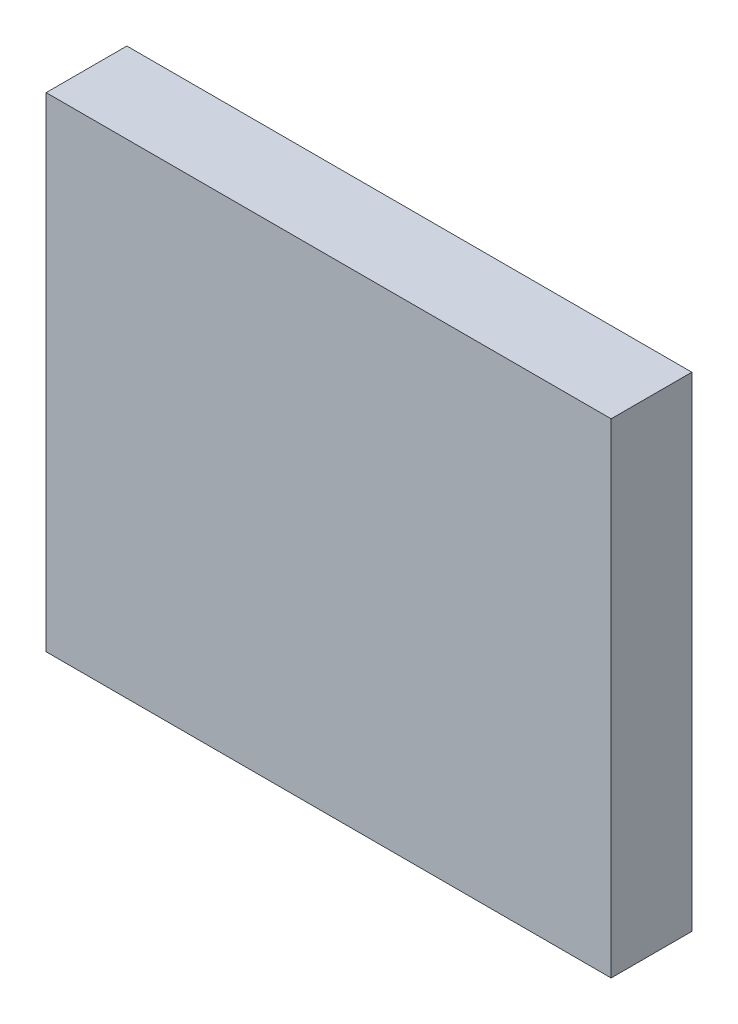
ISO-10303-21;
HEADER;
FILE_DESCRIPTION(('STEP AP214'),'2;1');
FILE_NAME('part.step','',(''),(''),'','','');
FILE_SCHEMA(('AUTOMOTIVE_DESIGN { 1 0 10303 214 1 1 1 1 }'));
ENDSEC;
DATA;
#1=APPLICATION_CONTEXT('core data for automotive mechanical design processes');
#2=APPLICATION_PROTOCOL_DEFINITION('international standard','automotive_design',2000,#1);
#3=PRODUCT_CONTEXT('',#1,'mechanical');
#4=PRODUCT('Part','Part','',(#3));
#5=PRODUCT_RELATED_PRODUCT_CATEGORY('part','',(#4));
#6=PRODUCT_DEFINITION_FORMATION('','',#4);
#7=PRODUCT_DEFINITION_CONTEXT('part definition',#1,'design');
#8=PRODUCT_DEFINITION('design','',#6,#7);
#9=PRODUCT_DEFINITION_SHAPE('','',#8);
#10=(LENGTH_UNIT() NAMED_UNIT(*) SI_UNIT(.MILLI.,.METRE.));
#11=(NAMED_UNIT(*) PLANE_ANGLE_UNIT() SI_UNIT($,.RADIAN.));
#12=(NAMED_UNIT(*) SI_UNIT($,.STERADIAN.) SOLID_ANGLE_UNIT());
#13=UNCERTAINTY_MEASURE_WITH_UNIT(LENGTH_MEASURE(1.E-05),#10,'distance_accuracy_value','');
#14=(GEOMETRIC_REPRESENTATION_CONTEXT(3) GLOBAL_UNCERTAINTY_ASSIGNED_CONTEXT((#13)) GLOBAL_UNIT_ASSIGNED_CONTEXT((#10,
#11,#12)) REPRESENTATION_CONTEXT('',''));
#15=CARTESIAN_POINT('',(0.,0.,0.));
#16=DIRECTION('',(0.,0.,1.));
#17=DIRECTION('',(1.,0.,0.));
#18=AXIS2_PLACEMENT_3D('',#15,#16,#17);
#19=CARTESIAN_POINT('',(87.5,150.,12.5));
#20=DIRECTION('',(-1.,0.,0.));
#21=DIRECTION('',(0.,0.,1.));
#22=AXIS2_PLACEMENT_3D('',#19,#20,#21);
#23=PLANE('',#22);
#24=DIRECTION('',(0.,0.,-1.));
#25=VECTOR('',#24,1.);
#26=CARTESIAN_POINT('',(87.5,0.,12.5));
#27=LINE('',#26,#25);
#28=CARTESIAN_POINT('',(87.5,0.,12.5));
#29=VERTEX_POINT('',#28);
#30=CARTESIAN_POINT('',(87.5,0.,-12.5));
#31=VERTEX_POINT('',#30);
#32=EDGE_CURVE('E102',#29,#31,#27,.T.);
#33=ORIENTED_EDGE('',*,*,#32,.T.);
#34=DIRECTION('',(0.,-1.,0.));
#35=VECTOR('',#34,1.);
#36=CARTESIAN_POINT('',(87.5,150.,-12.5));
#37=LINE('',#36,#35);
#38=CARTESIAN_POINT('',(87.5,150.,-12.5));
#39=VERTEX_POINT('',#38);
#40=EDGE_CURVE('E11',#39,#31,#37,.T.);
#41=ORIENTED_EDGE('',*,*,#40,.F.);
#42=DIRECTION('',(0.,0.,-1.));
#43=VECTOR('',#42,1.);
#44=CARTESIAN_POINT('',(87.5,150.,12.5));
#45=LINE('',#44,#43);
#46=CARTESIAN_POINT('',(87.5,150.,12.5));
#47=VERTEX_POINT('',#46);
#48=EDGE_CURVE('E90',#47,#39,#45,.T.);
#49=ORIENTED_EDGE('',*,*,#48,.F.);
#50=DIRECTION('',(0.,-1.,0.));
#51=VECTOR('',#50,1.);
#52=CARTESIAN_POINT('',(87.5,150.,12.5));
#53=LINE('',#52,#51);
#54=EDGE_CURVE('E98',#47,#29,#53,.T.);
#55=ORIENTED_EDGE('',*,*,#54,.T.);
#56=EDGE_LOOP('',(#33,#41,#49,#55));
#57=FACE_BOUND('',#56,.T.);
#58=ADVANCED_FACE('F39',(#57),#23,.F.);
#59=CARTESIAN_POINT('',(-87.5,150.,-12.5));
#60=DIRECTION('',(0.,0.,1.));
#61=DIRECTION('',(1.,0.,0.));
#62=AXIS2_PLACEMENT_3D('',#59,#60,#61);
#63=PLANE('',#62);
#64=DIRECTION('',(-1.,0.,0.));
#65=VECTOR('',#64,1.);
#66=CARTESIAN_POINT('',(-87.5,0.,-12.5));
#67=LINE('',#66,#65);
#68=CARTESIAN_POINT('',(-87.5,0.,-12.5));
#69=VERTEX_POINT('',#68);
#70=EDGE_CURVE('E94',#31,#69,#67,.T.);
#71=ORIENTED_EDGE('',*,*,#70,.T.);
#72=DIRECTION('',(0.,-1.,0.));
#73=VECTOR('',#72,1.);
#74=CARTESIAN_POINT('',(-87.5,150.,-12.5));
#75=LINE('',#74,#73);
#76=CARTESIAN_POINT('',(-87.5,150.,-12.5));
#77=VERTEX_POINT('',#76);
#78=EDGE_CURVE('E47',#77,#69,#75,.T.);
#79=ORIENTED_EDGE('',*,*,#78,.F.);
#80=DIRECTION('',(-1.,0.,0.));
#81=VECTOR('',#80,1.);
#82=CARTESIAN_POINT('',(-87.5,150.,-12.5));
#83=LINE('',#82,#81);
#84=EDGE_CURVE('E85',#39,#77,#83,.T.);
#85=ORIENTED_EDGE('',*,*,#84,.F.);
#86=ORIENTED_EDGE('',*,*,#40,.T.);
#87=EDGE_LOOP('',(#71,#79,#85,#86));
#88=FACE_BOUND('',#87,.T.);
#89=ADVANCED_FACE('F93',(#88),#63,.F.);
#90=CARTESIAN_POINT('',(-87.5,150.,12.5));
#91=DIRECTION('',(1.,0.,0.));
#92=DIRECTION('',(0.,0.,-1.));
#93=AXIS2_PLACEMENT_3D('',#90,#91,#92);
#94=PLANE('',#93);
#95=DIRECTION('',(0.,0.,1.));
#96=VECTOR('',#95,1.);
#97=CARTESIAN_POINT('',(-87.5,0.,12.5));
#98=LINE('',#97,#96);
#99=CARTESIAN_POINT('',(-87.5,0.,12.5));
#100=VERTEX_POINT('',#99);
#101=EDGE_CURVE('E72',#69,#100,#98,.T.);
#102=ORIENTED_EDGE('',*,*,#101,.T.);
#103=DIRECTION('',(0.,-1.,0.));
#104=VECTOR('',#103,1.);
#105=CARTESIAN_POINT('',(-87.5,150.,12.5));
#106=LINE('',#105,#104);
#107=CARTESIAN_POINT('',(-87.5,150.,12.5));
#108=VERTEX_POINT('',#107);
#109=EDGE_CURVE('E95',#108,#100,#106,.T.);
#110=ORIENTED_EDGE('',*,*,#109,.F.);
#111=DIRECTION('',(0.,0.,1.));
#112=VECTOR('',#111,1.);
#113=CARTESIAN_POINT('',(-87.5,150.,12.5));
#114=LINE('',#113,#112);
#115=EDGE_CURVE('E88',#77,#108,#114,.T.);
#116=ORIENTED_EDGE('',*,*,#115,.F.);
#117=ORIENTED_EDGE('',*,*,#78,.T.);
#118=EDGE_LOOP('',(#102,#110,#116,#117));
#119=FACE_BOUND('',#118,.T.);
#120=ADVANCED_FACE('F96',(#119),#94,.F.);
#121=CARTESIAN_POINT('',(-87.5,150.,12.5));
#122=DIRECTION('',(0.,0.,-1.));
#123=DIRECTION('',(-1.,0.,0.));
#124=AXIS2_PLACEMENT_3D('',#121,#122,#123);
#125=PLANE('',#124);
#126=DIRECTION('',(1.,0.,0.));
#127=VECTOR('',#126,1.);
#128=CARTESIAN_POINT('',(-87.5,0.,12.5));
#129=LINE('',#128,#127);
#130=EDGE_CURVE('E78',#100,#29,#129,.T.);
#131=ORIENTED_EDGE('',*,*,#130,.T.);
#132=ORIENTED_EDGE('',*,*,#54,.F.);
#133=DIRECTION('',(1.,0.,0.));
#134=VECTOR('',#133,1.);
#135=CARTESIAN_POINT('',(-87.5,150.,12.5));
#136=LINE('',#135,#134);
#137=EDGE_CURVE('E55',#108,#47,#136,.T.);
#138=ORIENTED_EDGE('',*,*,#137,.F.);
#139=ORIENTED_EDGE('',*,*,#109,.T.);
#140=EDGE_LOOP('',(#131,#132,#138,#139));
#141=FACE_BOUND('',#140,.T.);
#142=ADVANCED_FACE('F110',(#141),#125,.F.);
#143=CARTESIAN_POINT('',(0.,150.,0.));
#144=DIRECTION('',(0.,-1.,0.));
#145=DIRECTION('',(0.,0.,-1.));
#146=AXIS2_PLACEMENT_3D('',#143,#144,#145);
#147=PLANE('',#146);
#148=ORIENTED_EDGE('',*,*,#48,.T.);
#149=ORIENTED_EDGE('',*,*,#84,.T.);
#150=ORIENTED_EDGE('',*,*,#115,.T.);
#151=ORIENTED_EDGE('',*,*,#137,.T.);
#152=EDGE_LOOP('',(#148,#149,#150,#151));
#153=FACE_BOUND('',#152,.T.);
#154=ADVANCED_FACE('F86',(#153),#147,.F.);
#155=CARTESIAN_POINT('',(0.,0.,0.));
#156=DIRECTION('',(0.,-1.,0.));
#157=DIRECTION('',(0.,0.,-1.));
#158=AXIS2_PLACEMENT_3D('',#155,#156,#157);
#159=PLANE('',#158);
#160=CARTESIAN_POINT('',(-50.,0.,0.));
#161=DIRECTION('',(0.,1.,0.));
#162=DIRECTION('',(0.,0.,1.));
#163=AXIS2_PLACEMENT_3D('',#160,#161,#162);
#164=CIRCLE('',#163,4.);
#165=CARTESIAN_POINT('',(-50.,0.,4.));
#166=VERTEX_POINT('',#165);
#167=EDGE_CURVE('E122',#166,#166,#164,.T.);
#168=ORIENTED_EDGE('',*,*,#167,.T.);
#169=EDGE_LOOP('',(#168));
#170=FACE_BOUND('',#169,.T.);
#171=CARTESIAN_POINT('',(50.,0.,0.));
#172=DIRECTION('',(0.,1.,0.));
#173=DIRECTION('',(0.,0.,1.));
#174=AXIS2_PLACEMENT_3D('',#171,#172,#173);
#175=CIRCLE('',#174,4.);
#176=CARTESIAN_POINT('',(50.,0.,4.));
#177=VERTEX_POINT('',#176);
#178=EDGE_CURVE('E119',#177,#177,#175,.T.);
#179=ORIENTED_EDGE('',*,*,#178,.T.);
#180=EDGE_LOOP('',(#179));
#181=FACE_BOUND('',#180,.T.);
#182=ORIENTED_EDGE('',*,*,#32,.F.);
#183=ORIENTED_EDGE('',*,*,#130,.F.);
#184=ORIENTED_EDGE('',*,*,#101,.F.);
#185=ORIENTED_EDGE('',*,*,#70,.F.);
#186=EDGE_LOOP('',(#182,#183,#184,#185));
#187=FACE_BOUND('',#186,.T.);
#188=ADVANCED_FACE('F113',(#170,#181,#187),#159,.T.);
#189=CARTESIAN_POINT('',(50.,14.,0.));
#190=DIRECTION('',(0.,-1.,0.));
#191=DIRECTION('',(0.,0.,-1.));
#192=AXIS2_PLACEMENT_3D('',#189,#190,#191);
#193=CYLINDRICAL_SURFACE('',#192,4.);
#194=CARTESIAN_POINT('',(50.,14.,0.));
#195=DIRECTION('',(0.,1.,0.));
#196=DIRECTION('',(0.,0.,1.));
#197=AXIS2_PLACEMENT_3D('',#194,#195,#196);
#198=CIRCLE('',#197,4.);
#199=CARTESIAN_POINT('',(50.,14.,4.));
#200=VERTEX_POINT('',#199);
#201=EDGE_CURVE('E116',#200,#200,#198,.T.);
#202=ORIENTED_EDGE('',*,*,#201,.T.);
#203=EDGE_LOOP('',(#202));
#204=FACE_BOUND('',#203,.T.);
#205=ORIENTED_EDGE('',*,*,#178,.F.);
#206=EDGE_LOOP('',(#205));
#207=FACE_BOUND('',#206,.T.);
#208=ADVANCED_FACE('F152',(#204,#207),#193,.F.);
#209=CARTESIAN_POINT('',(50.,14.,0.));
#210=DIRECTION('',(0.,1.,0.));
#211=DIRECTION('',(0.,0.,1.));
#212=AXIS2_PLACEMENT_3D('',#209,#210,#211);
#213=PLANE('',#212);
#214=ORIENTED_EDGE('',*,*,#201,.F.);
#215=EDGE_LOOP('',(#214));
#216=FACE_BOUND('',#215,.T.);
#217=ADVANCED_FACE('F137',(#216),#213,.F.);
#218=CARTESIAN_POINT('',(-50.,14.,0.));
#219=DIRECTION('',(0.,-1.,0.));
#220=DIRECTION('',(0.,0.,-1.));
#221=AXIS2_PLACEMENT_3D('',#218,#219,#220);
#222=CYLINDRICAL_SURFACE('',#221,4.);
#223=CARTESIAN_POINT('',(-50.,14.,0.));
#224=DIRECTION('',(0.,1.,0.));
#225=DIRECTION('',(0.,0.,1.));
#226=AXIS2_PLACEMENT_3D('',#223,#224,#225);
#227=CIRCLE('',#226,4.);
#228=CARTESIAN_POINT('',(-50.,14.,4.));
#229=VERTEX_POINT('',#228);
#230=EDGE_CURVE('E105',#229,#229,#227,.T.);
#231=ORIENTED_EDGE('',*,*,#230,.T.);
#232=EDGE_LOOP('',(#231));
#233=FACE_BOUND('',#232,.T.);
#234=ORIENTED_EDGE('',*,*,#167,.F.);
#235=EDGE_LOOP('',(#234));
#236=FACE_BOUND('',#235,.T.);
#237=ADVANCED_FACE('F128',(#233,#236),#222,.F.);
#238=CARTESIAN_POINT('',(-50.,14.,0.));
#239=DIRECTION('',(0.,1.,0.));
#240=DIRECTION('',(0.,0.,1.));
#241=AXIS2_PLACEMENT_3D('',#238,#239,#240);
#242=PLANE('',#241);
#243=ORIENTED_EDGE('',*,*,#230,.F.);
#244=EDGE_LOOP('',(#243));
#245=FACE_BOUND('',#244,.T.);
#246=ADVANCED_FACE('F131',(#245),#242,.F.);
#247=CLOSED_SHELL('',(#58,#89,#120,#142,#154,#188,#208,#217,#237,#246));
#248=MANIFOLD_SOLID_BREP('B2',#247);
#249=ADVANCED_BREP_SHAPE_REPRESENTATION('',(#18,#248),#14);
#250=SHAPE_DEFINITION_REPRESENTATION(#9,#249);
ENDSEC;
END-ISO-10303-21;
